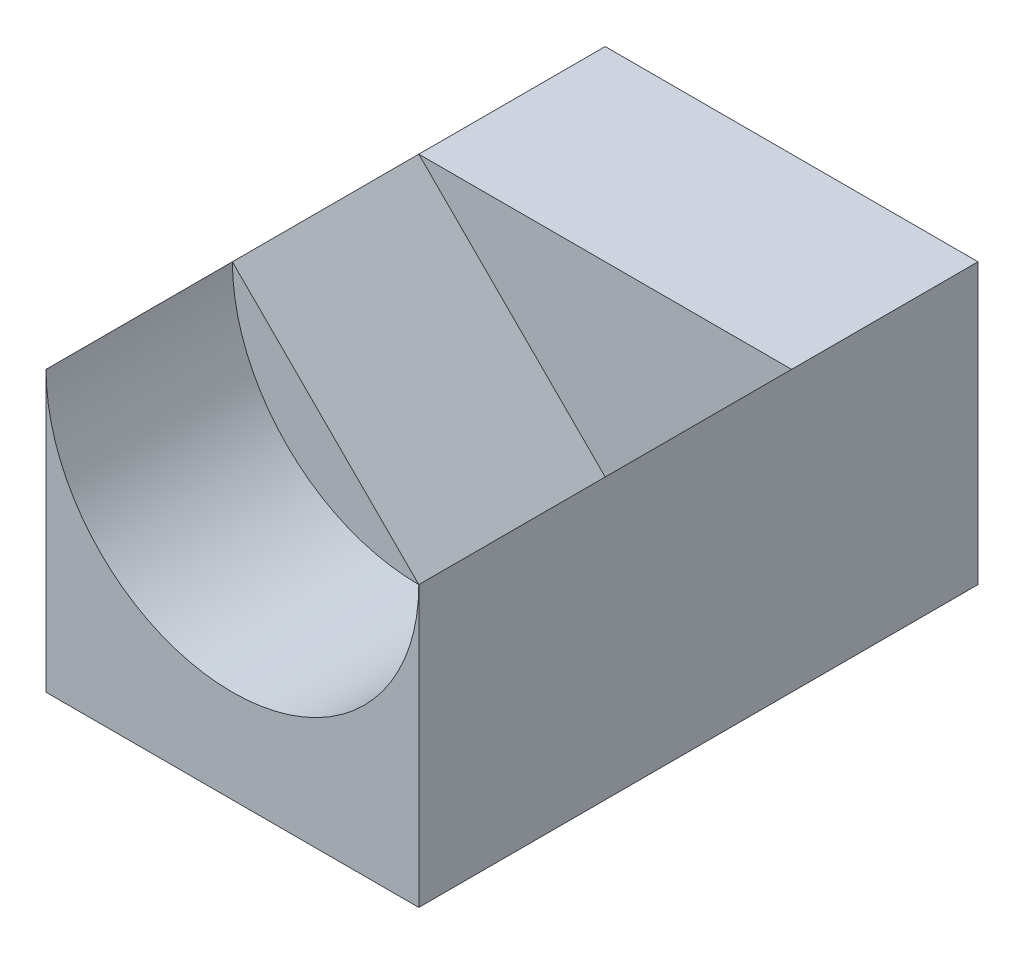
ISO-10303-21;
HEADER;
FILE_DESCRIPTION(('STEP AP214'),'2;1');
FILE_NAME('part.step','',(''),(''),'','','');
FILE_SCHEMA(('AUTOMOTIVE_DESIGN { 1 0 10303 214 1 1 1 1 }'));
ENDSEC;
DATA;
#1=APPLICATION_CONTEXT('core data for automotive mechanical design processes');
#2=APPLICATION_PROTOCOL_DEFINITION('international standard','automotive_design',2000,#1);
#3=PRODUCT_CONTEXT('',#1,'mechanical');
#4=PRODUCT('Part','Part','',(#3));
#5=PRODUCT_RELATED_PRODUCT_CATEGORY('part','',(#4));
#6=PRODUCT_DEFINITION_FORMATION('','',#4);
#7=PRODUCT_DEFINITION_CONTEXT('part definition',#1,'design');
#8=PRODUCT_DEFINITION('design','',#6,#7);
#9=PRODUCT_DEFINITION_SHAPE('','',#8);
#10=(LENGTH_UNIT() NAMED_UNIT(*) SI_UNIT(.MILLI.,.METRE.));
#11=(NAMED_UNIT(*) PLANE_ANGLE_UNIT() SI_UNIT($,.RADIAN.));
#12=(NAMED_UNIT(*) SI_UNIT($,.STERADIAN.) SOLID_ANGLE_UNIT());
#13=UNCERTAINTY_MEASURE_WITH_UNIT(LENGTH_MEASURE(1.E-05),#10,'distance_accuracy_value','');
#14=(GEOMETRIC_REPRESENTATION_CONTEXT(3) GLOBAL_UNCERTAINTY_ASSIGNED_CONTEXT((#13)) GLOBAL_UNIT_ASSIGNED_CONTEXT((#10,
#11,#12)) REPRESENTATION_CONTEXT('',''));
#15=CARTESIAN_POINT('',(0.,0.,0.));
#16=DIRECTION('',(0.,0.,1.));
#17=DIRECTION('',(1.,0.,0.));
#18=AXIS2_PLACEMENT_3D('',#15,#16,#17);
#19=CARTESIAN_POINT('',(0.,30.,0.));
#20=DIRECTION('',(0.,1.,0.));
#21=DIRECTION('',(0.,0.,1.));
#22=AXIS2_PLACEMENT_3D('',#19,#20,#21);
#23=PLANE('',#22);
#24=DIRECTION('',(0.,0.,1.));
#25=VECTOR('',#24,1.);
#26=CARTESIAN_POINT('',(-20.,30.,-30.));
#27=LINE('',#26,#25);
#28=CARTESIAN_POINT('',(-20.,30.,-30.));
#29=VERTEX_POINT('',#28);
#30=CARTESIAN_POINT('',(-20.,29.9999999999999,-10.));
#31=VERTEX_POINT('',#30);
#32=EDGE_CURVE('E95',#29,#31,#27,.T.);
#33=ORIENTED_EDGE('',*,*,#32,.T.);
#34=DIRECTION('',(-1.,0.,0.));
#35=VECTOR('',#34,1.);
#36=CARTESIAN_POINT('',(20.,30.,-10.));
#37=LINE('',#36,#35);
#38=CARTESIAN_POINT('',(20.,30.,-10.));
#39=VERTEX_POINT('',#38);
#40=EDGE_CURVE('E128',#39,#31,#37,.T.);
#41=ORIENTED_EDGE('',*,*,#40,.F.);
#42=DIRECTION('',(0.,0.,-1.));
#43=VECTOR('',#42,1.);
#44=CARTESIAN_POINT('',(20.,30.,-30.));
#45=LINE('',#44,#43);
#46=CARTESIAN_POINT('',(20.,30.,-30.));
#47=VERTEX_POINT('',#46);
#48=EDGE_CURVE('E86',#39,#47,#45,.T.);
#49=ORIENTED_EDGE('',*,*,#48,.T.);
#50=DIRECTION('',(-1.,0.,0.));
#51=VECTOR('',#50,1.);
#52=CARTESIAN_POINT('',(-20.,30.,-30.));
#53=LINE('',#52,#51);
#54=EDGE_CURVE('E53',#47,#29,#53,.T.);
#55=ORIENTED_EDGE('',*,*,#54,.T.);
#56=EDGE_LOOP('',(#33,#41,#49,#55));
#57=FACE_BOUND('',#56,.T.);
#58=ADVANCED_FACE('F36',(#57),#23,.T.);
#59=CARTESIAN_POINT('',(0.,30.,10.));
#60=DIRECTION('',(0.,0.,1.));
#61=DIRECTION('',(1.,0.,0.));
#62=AXIS2_PLACEMENT_3D('',#59,#60,#61);
#63=PLANE('',#62);
#64=DIRECTION('',(0.707106781186548,0.707106781186547,0.));
#65=VECTOR('',#64,1.);
#66=CARTESIAN_POINT('',(0.,10.,10.));
#67=LINE('',#66,#65);
#68=CARTESIAN_POINT('',(0.,10.,10.));
#69=VERTEX_POINT('',#68);
#70=CARTESIAN_POINT('',(20.,30.,10.));
#71=VERTEX_POINT('',#70);
#72=EDGE_CURVE('E160',#69,#71,#67,.T.);
#73=ORIENTED_EDGE('',*,*,#72,.F.);
#74=CARTESIAN_POINT('',(0.,30.,10.));
#75=DIRECTION('',(0.,0.,1.));
#76=DIRECTION('',(1.,0.,0.));
#77=AXIS2_PLACEMENT_3D('',#74,#75,#76);
#78=CIRCLE('',#77,20.);
#79=EDGE_CURVE('E150',#69,#71,#78,.T.);
#80=ORIENTED_EDGE('',*,*,#79,.T.);
#81=EDGE_LOOP('',(#73,#80));
#82=FACE_BOUND('',#81,.T.);
#83=ADVANCED_FACE('F179',(#82),#63,.T.);
#84=CARTESIAN_POINT('',(20.,30.,-30.));
#85=DIRECTION('',(-1.,0.,0.));
#86=DIRECTION('',(0.,0.,1.));
#87=AXIS2_PLACEMENT_3D('',#84,#85,#86);
#88=PLANE('',#87);
#89=DIRECTION('',(0.,0.,-1.));
#90=VECTOR('',#89,1.);
#91=CARTESIAN_POINT('',(20.,0.,-30.));
#92=LINE('',#91,#90);
#93=CARTESIAN_POINT('',(20.,0.,30.));
#94=VERTEX_POINT('',#93);
#95=CARTESIAN_POINT('',(20.,0.,-30.));
#96=VERTEX_POINT('',#95);
#97=EDGE_CURVE('E91',#94,#96,#92,.T.);
#98=ORIENTED_EDGE('',*,*,#97,.T.);
#99=DIRECTION('',(0.,-1.,0.));
#100=VECTOR('',#99,1.);
#101=CARTESIAN_POINT('',(20.,30.,-30.));
#102=LINE('',#101,#100);
#103=EDGE_CURVE('E11',#47,#96,#102,.T.);
#104=ORIENTED_EDGE('',*,*,#103,.F.);
#105=ORIENTED_EDGE('',*,*,#48,.F.);
#106=EDGE_CURVE('E118',#71,#39,#45,.T.);
#107=ORIENTED_EDGE('',*,*,#106,.F.);
#108=CARTESIAN_POINT('',(20.,30.,30.));
#109=VERTEX_POINT('',#108);
#110=EDGE_CURVE('E94',#109,#71,#45,.T.);
#111=ORIENTED_EDGE('',*,*,#110,.F.);
#112=DIRECTION('',(0.,-1.,0.));
#113=VECTOR('',#112,1.);
#114=CARTESIAN_POINT('',(20.,30.,30.));
#115=LINE('',#114,#113);
#116=EDGE_CURVE('E81',#109,#94,#115,.T.);
#117=ORIENTED_EDGE('',*,*,#116,.T.);
#118=EDGE_LOOP('',(#98,#104,#105,#107,#111,#117));
#119=FACE_BOUND('',#118,.T.);
#120=ADVANCED_FACE('F38',(#119),#88,.F.);
#121=CARTESIAN_POINT('',(-20.,30.,-30.));
#122=DIRECTION('',(0.,0.,1.));
#123=DIRECTION('',(1.,0.,0.));
#124=AXIS2_PLACEMENT_3D('',#121,#122,#123);
#125=PLANE('',#124);
#126=DIRECTION('',(-1.,0.,0.));
#127=VECTOR('',#126,1.);
#128=CARTESIAN_POINT('',(-20.,0.,-30.));
#129=LINE('',#128,#127);
#130=CARTESIAN_POINT('',(-20.,0.,-30.));
#131=VERTEX_POINT('',#130);
#132=EDGE_CURVE('E98',#96,#131,#129,.T.);
#133=ORIENTED_EDGE('',*,*,#132,.T.);
#134=DIRECTION('',(0.,-1.,0.));
#135=VECTOR('',#134,1.);
#136=CARTESIAN_POINT('',(-20.,30.,-30.));
#137=LINE('',#136,#135);
#138=EDGE_CURVE('E45',#29,#131,#137,.T.);
#139=ORIENTED_EDGE('',*,*,#138,.F.);
#140=ORIENTED_EDGE('',*,*,#54,.F.);
#141=ORIENTED_EDGE('',*,*,#103,.T.);
#142=EDGE_LOOP('',(#133,#139,#140,#141));
#143=FACE_BOUND('',#142,.T.);
#144=ADVANCED_FACE('F113',(#143),#125,.F.);
#145=CARTESIAN_POINT('',(-20.,30.,-30.));
#146=DIRECTION('',(1.,0.,0.));
#147=DIRECTION('',(0.,0.,-1.));
#148=AXIS2_PLACEMENT_3D('',#145,#146,#147);
#149=PLANE('',#148);
#150=DIRECTION('',(0.,0.,1.));
#151=VECTOR('',#150,1.);
#152=CARTESIAN_POINT('',(-20.,0.,-30.));
#153=LINE('',#152,#151);
#154=CARTESIAN_POINT('',(-20.,0.,30.));
#155=VERTEX_POINT('',#154);
#156=EDGE_CURVE('E70',#131,#155,#153,.T.);
#157=ORIENTED_EDGE('',*,*,#156,.T.);
#158=DIRECTION('',(0.,-1.,0.));
#159=VECTOR('',#158,1.);
#160=CARTESIAN_POINT('',(-20.,30.,30.));
#161=LINE('',#160,#159);
#162=CARTESIAN_POINT('',(-20.,30.,30.));
#163=VERTEX_POINT('',#162);
#164=EDGE_CURVE('E83',#163,#155,#161,.T.);
#165=ORIENTED_EDGE('',*,*,#164,.F.);
#166=DIRECTION('',(0.,0.,1.));
#167=VECTOR('',#166,1.);
#168=CARTESIAN_POINT('',(-20.,30.,10.));
#169=LINE('',#168,#167);
#170=CARTESIAN_POINT('',(-20.,30.,10.));
#171=VERTEX_POINT('',#170);
#172=EDGE_CURVE('E99',#171,#163,#169,.T.);
#173=ORIENTED_EDGE('',*,*,#172,.F.);
#174=DIRECTION('',(0.,0.,1.));
#175=VECTOR('',#174,1.);
#176=CARTESIAN_POINT('',(-20.,29.9999999999999,-10.));
#177=LINE('',#176,#175);
#178=EDGE_CURVE('E155',#31,#171,#177,.T.);
#179=ORIENTED_EDGE('',*,*,#178,.F.);
#180=ORIENTED_EDGE('',*,*,#32,.F.);
#181=ORIENTED_EDGE('',*,*,#138,.T.);
#182=EDGE_LOOP('',(#157,#165,#173,#179,#180,#181));
#183=FACE_BOUND('',#182,.T.);
#184=ADVANCED_FACE('F110',(#183),#149,.F.);
#185=CARTESIAN_POINT('',(-20.,30.,30.));
#186=DIRECTION('',(0.,0.,-1.));
#187=DIRECTION('',(-1.,0.,0.));
#188=AXIS2_PLACEMENT_3D('',#185,#186,#187);
#189=PLANE('',#188);
#190=ORIENTED_EDGE('',*,*,#116,.F.);
#191=CARTESIAN_POINT('',(0.,30.,30.));
#192=DIRECTION('',(0.,0.,1.));
#193=DIRECTION('',(1.,0.,0.));
#194=AXIS2_PLACEMENT_3D('',#191,#192,#193);
#195=CIRCLE('',#194,20.);
#196=EDGE_CURVE('E148',#163,#109,#195,.T.);
#197=ORIENTED_EDGE('',*,*,#196,.F.);
#198=ORIENTED_EDGE('',*,*,#164,.T.);
#199=DIRECTION('',(1.,0.,0.));
#200=VECTOR('',#199,1.);
#201=CARTESIAN_POINT('',(-20.,0.,30.));
#202=LINE('',#201,#200);
#203=EDGE_CURVE('E76',#155,#94,#202,.T.);
#204=ORIENTED_EDGE('',*,*,#203,.T.);
#205=EDGE_LOOP('',(#190,#197,#198,#204));
#206=FACE_BOUND('',#205,.T.);
#207=ADVANCED_FACE('F78',(#206),#189,.F.);
#208=CARTESIAN_POINT('',(0.,0.,0.));
#209=DIRECTION('',(0.,1.,0.));
#210=DIRECTION('',(0.,0.,1.));
#211=AXIS2_PLACEMENT_3D('',#208,#209,#210);
#212=PLANE('',#211);
#213=ORIENTED_EDGE('',*,*,#97,.F.);
#214=ORIENTED_EDGE('',*,*,#203,.F.);
#215=ORIENTED_EDGE('',*,*,#156,.F.);
#216=ORIENTED_EDGE('',*,*,#132,.F.);
#217=EDGE_LOOP('',(#213,#214,#215,#216));
#218=FACE_BOUND('',#217,.T.);
#219=ADVANCED_FACE('F97',(#218),#212,.F.);
#220=CARTESIAN_POINT('',(0.,30.,10.));
#221=DIRECTION('',(0.,0.,1.));
#222=DIRECTION('',(1.,0.,0.));
#223=AXIS2_PLACEMENT_3D('',#220,#221,#222);
#224=CYLINDRICAL_SURFACE('',#223,20.);
#225=ORIENTED_EDGE('',*,*,#196,.T.);
#226=ORIENTED_EDGE('',*,*,#110,.T.);
#227=ORIENTED_EDGE('',*,*,#79,.F.);
#228=EDGE_CURVE('E103',#171,#69,#78,.T.);
#229=ORIENTED_EDGE('',*,*,#228,.F.);
#230=ORIENTED_EDGE('',*,*,#172,.T.);
#231=EDGE_LOOP('',(#225,#226,#227,#229,#230));
#232=FACE_BOUND('',#231,.T.);
#233=ADVANCED_FACE('F147',(#232),#224,.F.);
#234=DIRECTION('',(0.70710678118655,-0.707106781186545,0.));
#235=VECTOR('',#234,1.);
#236=CARTESIAN_POINT('',(-20.,29.9999999999999,10.));
#237=LINE('',#236,#235);
#238=EDGE_CURVE('E162',#171,#69,#237,.T.);
#239=ORIENTED_EDGE('',*,*,#238,.F.);
#240=ORIENTED_EDGE('',*,*,#228,.T.);
#241=EDGE_LOOP('',(#239,#240));
#242=FACE_BOUND('',#241,.T.);
#243=ADVANCED_FACE('F175',(#242),#63,.T.);
#244=CARTESIAN_POINT('',(0.,10.,-10.));
#245=DIRECTION('',(0.707106781186547,-0.707106781186548,0.));
#246=DIRECTION('',(0.707106781186548,0.707106781186547,0.));
#247=AXIS2_PLACEMENT_3D('',#244,#245,#246);
#248=PLANE('',#247);
#249=ORIENTED_EDGE('',*,*,#72,.T.);
#250=ORIENTED_EDGE('',*,*,#106,.T.);
#251=DIRECTION('',(0.707106781186548,0.707106781186547,0.));
#252=VECTOR('',#251,1.);
#253=CARTESIAN_POINT('',(0.,10.,-10.));
#254=LINE('',#253,#252);
#255=CARTESIAN_POINT('',(0.,10.,-10.));
#256=VERTEX_POINT('',#255);
#257=EDGE_CURVE('E158',#256,#39,#254,.T.);
#258=ORIENTED_EDGE('',*,*,#257,.F.);
#259=DIRECTION('',(0.,0.,1.));
#260=VECTOR('',#259,1.);
#261=CARTESIAN_POINT('',(0.,10.,-10.));
#262=LINE('',#261,#260);
#263=EDGE_CURVE('E151',#256,#69,#262,.T.);
#264=ORIENTED_EDGE('',*,*,#263,.T.);
#265=EDGE_LOOP('',(#249,#250,#258,#264));
#266=FACE_BOUND('',#265,.T.);
#267=ADVANCED_FACE('F177',(#266),#248,.F.);
#268=CARTESIAN_POINT('',(-20.,29.9999999999999,-10.));
#269=DIRECTION('',(-0.707106781186545,-0.70710678118655,0.));
#270=DIRECTION('',(0.70710678118655,-0.707106781186545,0.));
#271=AXIS2_PLACEMENT_3D('',#268,#269,#270);
#272=PLANE('',#271);
#273=ORIENTED_EDGE('',*,*,#238,.T.);
#274=ORIENTED_EDGE('',*,*,#263,.F.);
#275=DIRECTION('',(0.70710678118655,-0.707106781186545,0.));
#276=VECTOR('',#275,1.);
#277=CARTESIAN_POINT('',(-20.,29.9999999999999,-10.));
#278=LINE('',#277,#276);
#279=EDGE_CURVE('E135',#31,#256,#278,.T.);
#280=ORIENTED_EDGE('',*,*,#279,.F.);
#281=ORIENTED_EDGE('',*,*,#178,.T.);
#282=EDGE_LOOP('',(#273,#274,#280,#281));
#283=FACE_BOUND('',#282,.T.);
#284=ADVANCED_FACE('F172',(#283),#272,.F.);
#285=CARTESIAN_POINT('',(0.,0.,-10.));
#286=DIRECTION('',(0.,0.,1.));
#287=DIRECTION('',(1.,0.,0.));
#288=AXIS2_PLACEMENT_3D('',#285,#286,#287);
#289=PLANE('',#288);
#290=ORIENTED_EDGE('',*,*,#40,.T.);
#291=ORIENTED_EDGE('',*,*,#279,.T.);
#292=ORIENTED_EDGE('',*,*,#257,.T.);
#293=EDGE_LOOP('',(#290,#291,#292));
#294=FACE_BOUND('',#293,.T.);
#295=ADVANCED_FACE('F169',(#294),#289,.T.);
#296=CLOSED_SHELL('',(#58,#83,#120,#144,#184,#207,#219,#233,#243,#267,#284,#295));
#297=MANIFOLD_SOLID_BREP('B2',#296);
#298=ADVANCED_BREP_SHAPE_REPRESENTATION('',(#18,#297),#14);
#299=SHAPE_DEFINITION_REPRESENTATION(#9,#298);
ENDSEC;
END-ISO-10303-21;
